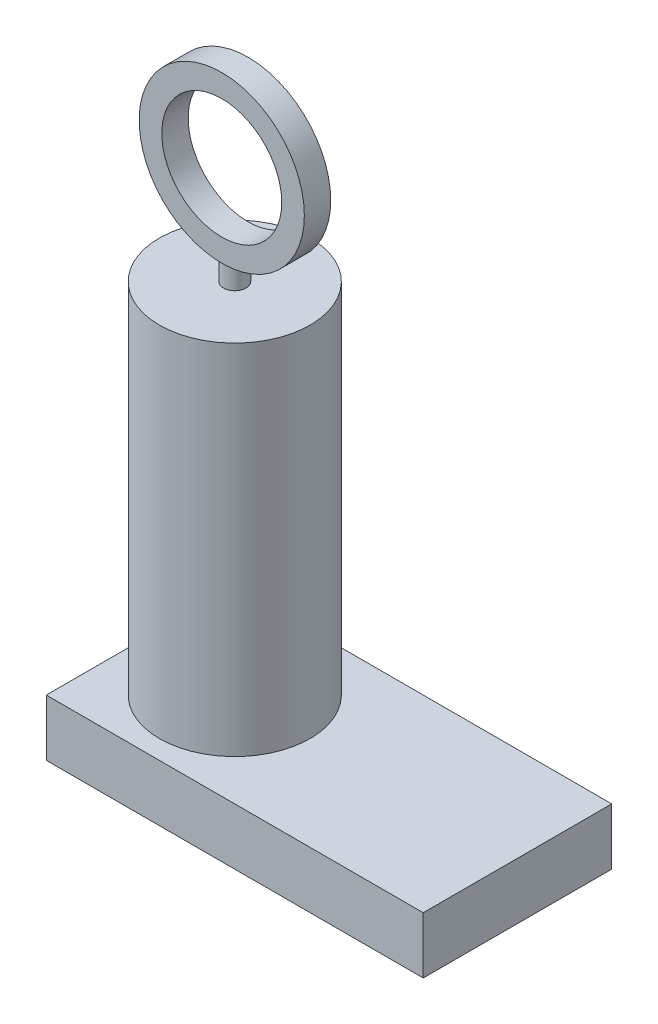
ISO-10303-21;
HEADER;
FILE_DESCRIPTION(('STEP AP214'),'2;1');
FILE_NAME('part.step','',(''),(''),'','','');
FILE_SCHEMA(('AUTOMOTIVE_DESIGN { 1 0 10303 214 1 1 1 1 }'));
ENDSEC;
DATA;
#1=APPLICATION_CONTEXT('core data for automotive mechanical design processes');
#2=APPLICATION_PROTOCOL_DEFINITION('international standard','automotive_design',2000,#1);
#3=PRODUCT_CONTEXT('',#1,'mechanical');
#4=PRODUCT('Part','Part','',(#3));
#5=PRODUCT_RELATED_PRODUCT_CATEGORY('part','',(#4));
#6=PRODUCT_DEFINITION_FORMATION('','',#4);
#7=PRODUCT_DEFINITION_CONTEXT('part definition',#1,'design');
#8=PRODUCT_DEFINITION('design','',#6,#7);
#9=PRODUCT_DEFINITION_SHAPE('','',#8);
#10=(LENGTH_UNIT() NAMED_UNIT(*) SI_UNIT(.MILLI.,.METRE.));
#11=(NAMED_UNIT(*) PLANE_ANGLE_UNIT() SI_UNIT($,.RADIAN.));
#12=(NAMED_UNIT(*) SI_UNIT($,.STERADIAN.) SOLID_ANGLE_UNIT());
#13=UNCERTAINTY_MEASURE_WITH_UNIT(LENGTH_MEASURE(1.E-05),#10,'distance_accuracy_value','');
#14=(GEOMETRIC_REPRESENTATION_CONTEXT(3) GLOBAL_UNCERTAINTY_ASSIGNED_CONTEXT((#13)) GLOBAL_UNIT_ASSIGNED_CONTEXT((#10,
#11,#12)) REPRESENTATION_CONTEXT('',''));
#15=CARTESIAN_POINT('',(0.,0.,0.));
#16=DIRECTION('',(0.,0.,1.));
#17=DIRECTION('',(1.,0.,0.));
#18=AXIS2_PLACEMENT_3D('',#15,#16,#17);
#19=CARTESIAN_POINT('',(0.,201.877080341597,6.90062805099283));
#20=DIRECTION('',(0.,0.,1.));
#21=DIRECTION('',(1.,0.,0.));
#22=AXIS2_PLACEMENT_3D('',#19,#20,#21);
#23=PLANE('',#22);
#24=CARTESIAN_POINT('',(0.,245.698971077735,6.90062805099283));
#25=DIRECTION('',(0.,0.,1.));
#26=DIRECTION('',(1.,0.,0.));
#27=AXIS2_PLACEMENT_3D('',#24,#25,#26);
#28=CIRCLE('',#27,43.821890736138);
#29=CARTESIAN_POINT('',(43.821890736138,245.698971077735,6.90062805099283));
#30=VERTEX_POINT('',#29);
#31=EDGE_CURVE('E55',#30,#30,#28,.T.);
#32=ORIENTED_EDGE('',*,*,#31,.T.);
#33=EDGE_LOOP('',(#32));
#34=FACE_BOUND('',#33,.T.);
#35=CARTESIAN_POINT('',(0.,245.698971077735,6.90062805099283));
#36=DIRECTION('',(0.,0.,1.));
#37=DIRECTION('',(1.,0.,0.));
#38=AXIS2_PLACEMENT_3D('',#35,#36,#37);
#39=CIRCLE('',#38,31.821890736138);
#40=CARTESIAN_POINT('',(31.821890736138,245.698971077735,6.90062805099283));
#41=VERTEX_POINT('',#40);
#42=EDGE_CURVE('E11',#41,#41,#39,.T.);
#43=ORIENTED_EDGE('',*,*,#42,.F.);
#44=EDGE_LOOP('',(#43));
#45=FACE_BOUND('',#44,.T.);
#46=ADVANCED_FACE('F41',(#34,#45),#23,.T.);
#47=CARTESIAN_POINT('',(0.,245.698971077735,6.));
#48=DIRECTION('',(0.,0.,1.));
#49=DIRECTION('',(1.,0.,0.));
#50=AXIS2_PLACEMENT_3D('',#47,#48,#49);
#51=CYLINDRICAL_SURFACE('',#50,31.821890736138);
#52=ORIENTED_EDGE('',*,*,#42,.T.);
#53=EDGE_LOOP('',(#52));
#54=FACE_BOUND('',#53,.T.);
#55=CARTESIAN_POINT('',(0.,245.698971077735,-7.09937194900717));
#56=DIRECTION('',(0.,0.,1.));
#57=DIRECTION('',(1.,0.,0.));
#58=AXIS2_PLACEMENT_3D('',#55,#56,#57);
#59=CIRCLE('',#58,31.821890736138);
#60=CARTESIAN_POINT('',(31.821890736138,245.698971077735,-7.09937194900717));
#61=VERTEX_POINT('',#60);
#62=EDGE_CURVE('E47',#61,#61,#59,.T.);
#63=ORIENTED_EDGE('',*,*,#62,.F.);
#64=EDGE_LOOP('',(#63));
#65=FACE_BOUND('',#64,.T.);
#66=ADVANCED_FACE('F71',(#54,#65),#51,.F.);
#67=CARTESIAN_POINT('',(0.,201.877080341597,-7.09937194900717));
#68=DIRECTION('',(0.,0.,-1.));
#69=DIRECTION('',(-1.,0.,0.));
#70=AXIS2_PLACEMENT_3D('',#67,#68,#69);
#71=PLANE('',#70);
#72=ORIENTED_EDGE('',*,*,#62,.T.);
#73=EDGE_LOOP('',(#72));
#74=FACE_BOUND('',#73,.T.);
#75=CARTESIAN_POINT('',(0.,245.698971077735,-7.09937194900717));
#76=DIRECTION('',(0.,0.,1.));
#77=DIRECTION('',(1.,0.,0.));
#78=AXIS2_PLACEMENT_3D('',#75,#76,#77);
#79=CIRCLE('',#78,43.821890736138);
#80=CARTESIAN_POINT('',(43.821890736138,245.698971077735,-7.09937194900717));
#81=VERTEX_POINT('',#80);
#82=EDGE_CURVE('E51',#81,#81,#79,.T.);
#83=ORIENTED_EDGE('',*,*,#82,.F.);
#84=EDGE_LOOP('',(#83));
#85=FACE_BOUND('',#84,.T.);
#86=ADVANCED_FACE('F65',(#74,#85),#71,.T.);
#87=CARTESIAN_POINT('',(0.,245.698971077735,6.));
#88=DIRECTION('',(0.,0.,1.));
#89=DIRECTION('',(1.,0.,0.));
#90=AXIS2_PLACEMENT_3D('',#87,#88,#89);
#91=CYLINDRICAL_SURFACE('',#90,43.821890736138);
#92=ORIENTED_EDGE('',*,*,#82,.T.);
#93=EDGE_LOOP('',(#92));
#94=FACE_BOUND('',#93,.T.);
#95=ORIENTED_EDGE('',*,*,#31,.F.);
#96=EDGE_LOOP('',(#95));
#97=FACE_BOUND('',#96,.T.);
#98=ADVANCED_FACE('F63',(#94,#97),#91,.T.);
#99=CLOSED_SHELL('',(#46,#66,#86,#98));
#100=MANIFOLD_SOLID_BREP('B2',#99);
#101=CARTESIAN_POINT('',(0.,190.,0.));
#102=DIRECTION('',(0.,-1.,0.));
#103=DIRECTION('',(0.,0.,-1.));
#104=AXIS2_PLACEMENT_3D('',#101,#102,#103);
#105=CYLINDRICAL_SURFACE('',#104,40.);
#106=CARTESIAN_POINT('',(0.,190.,0.));
#107=DIRECTION('',(0.,1.,0.));
#108=DIRECTION('',(0.,0.,1.));
#109=AXIS2_PLACEMENT_3D('',#106,#107,#108);
#110=CIRCLE('',#109,40.);
#111=CARTESIAN_POINT('',(0.,190.,40.));
#112=VERTEX_POINT('',#111);
#113=EDGE_CURVE('E112',#112,#112,#110,.T.);
#114=ORIENTED_EDGE('',*,*,#113,.F.);
#115=EDGE_LOOP('',(#114));
#116=FACE_BOUND('',#115,.T.);
#117=CARTESIAN_POINT('',(0.,0.,0.));
#118=DIRECTION('',(0.,1.,0.));
#119=DIRECTION('',(0.,0.,1.));
#120=AXIS2_PLACEMENT_3D('',#117,#118,#119);
#121=CIRCLE('',#120,40.);
#122=CARTESIAN_POINT('',(0.,0.,40.));
#123=VERTEX_POINT('',#122);
#124=EDGE_CURVE('E106',#123,#123,#121,.T.);
#125=ORIENTED_EDGE('',*,*,#124,.T.);
#126=EDGE_LOOP('',(#125));
#127=FACE_BOUND('',#126,.T.);
#128=ADVANCED_FACE('F103',(#116,#127),#105,.T.);
#129=CARTESIAN_POINT('',(0.,190.,0.));
#130=DIRECTION('',(0.,1.,0.));
#131=DIRECTION('',(0.,0.,1.));
#132=AXIS2_PLACEMENT_3D('',#129,#130,#131);
#133=PLANE('',#132);
#134=CARTESIAN_POINT('',(0.,190.,0.));
#135=DIRECTION('',(0.,1.,0.));
#136=DIRECTION('',(0.,0.,1.));
#137=AXIS2_PLACEMENT_3D('',#134,#135,#136);
#138=CIRCLE('',#137,6.);
#139=CARTESIAN_POINT('',(0.,190.,6.));
#140=VERTEX_POINT('',#139);
#141=EDGE_CURVE('E39',#140,#140,#138,.T.);
#142=ORIENTED_EDGE('',*,*,#141,.F.);
#143=EDGE_LOOP('',(#142));
#144=FACE_BOUND('',#143,.T.);
#145=ORIENTED_EDGE('',*,*,#113,.T.);
#146=EDGE_LOOP('',(#145));
#147=FACE_BOUND('',#146,.T.);
#148=ADVANCED_FACE('F206',(#144,#147),#133,.T.);
#149=CARTESIAN_POINT('',(-50.,-30.,50.));
#150=DIRECTION('',(1.,0.,0.));
#151=DIRECTION('',(0.,0.,-1.));
#152=AXIS2_PLACEMENT_3D('',#149,#150,#151);
#153=PLANE('',#152);
#154=DIRECTION('',(0.,0.,-1.));
#155=VECTOR('',#154,1.);
#156=CARTESIAN_POINT('',(-50.,0.,50.));
#157=LINE('',#156,#155);
#158=CARTESIAN_POINT('',(-50.,0.,50.));
#159=VERTEX_POINT('',#158);
#160=CARTESIAN_POINT('',(-50.,0.,-50.));
#161=VERTEX_POINT('',#160);
#162=EDGE_CURVE('E172',#159,#161,#157,.T.);
#163=ORIENTED_EDGE('',*,*,#162,.T.);
#164=DIRECTION('',(0.,1.,0.));
#165=VECTOR('',#164,1.);
#166=CARTESIAN_POINT('',(-50.,-30.,-50.));
#167=LINE('',#166,#165);
#168=CARTESIAN_POINT('',(-50.,-30.,-50.));
#169=VERTEX_POINT('',#168);
#170=EDGE_CURVE('E163',#169,#161,#167,.T.);
#171=ORIENTED_EDGE('',*,*,#170,.F.);
#172=DIRECTION('',(0.,0.,-1.));
#173=VECTOR('',#172,1.);
#174=CARTESIAN_POINT('',(-50.,-30.,50.));
#175=LINE('',#174,#173);
#176=CARTESIAN_POINT('',(-50.,-30.,50.));
#177=VERTEX_POINT('',#176);
#178=EDGE_CURVE('E157',#177,#169,#175,.T.);
#179=ORIENTED_EDGE('',*,*,#178,.F.);
#180=DIRECTION('',(0.,1.,0.));
#181=VECTOR('',#180,1.);
#182=CARTESIAN_POINT('',(-50.,-30.,50.));
#183=LINE('',#182,#181);
#184=EDGE_CURVE('E168',#177,#159,#183,.T.);
#185=ORIENTED_EDGE('',*,*,#184,.T.);
#186=EDGE_LOOP('',(#163,#171,#179,#185));
#187=FACE_BOUND('',#186,.T.);
#188=ADVANCED_FACE('F195',(#187),#153,.F.);
#189=CARTESIAN_POINT('',(-50.,-30.,-50.));
#190=DIRECTION('',(0.,0.,1.));
#191=DIRECTION('',(1.,0.,0.));
#192=AXIS2_PLACEMENT_3D('',#189,#190,#191);
#193=PLANE('',#192);
#194=DIRECTION('',(1.,0.,0.));
#195=VECTOR('',#194,1.);
#196=CARTESIAN_POINT('',(-50.,0.,-50.));
#197=LINE('',#196,#195);
#198=CARTESIAN_POINT('',(150.,0.,-50.));
#199=VERTEX_POINT('',#198);
#200=EDGE_CURVE('E162',#161,#199,#197,.T.);
#201=ORIENTED_EDGE('',*,*,#200,.T.);
#202=DIRECTION('',(0.,1.,0.));
#203=VECTOR('',#202,1.);
#204=CARTESIAN_POINT('',(150.,-30.,-50.));
#205=LINE('',#204,#203);
#206=CARTESIAN_POINT('',(150.,-30.,-50.));
#207=VERTEX_POINT('',#206);
#208=EDGE_CURVE('E160',#207,#199,#205,.T.);
#209=ORIENTED_EDGE('',*,*,#208,.F.);
#210=DIRECTION('',(1.,0.,0.));
#211=VECTOR('',#210,1.);
#212=CARTESIAN_POINT('',(-50.,-30.,-50.));
#213=LINE('',#212,#211);
#214=EDGE_CURVE('E152',#169,#207,#213,.T.);
#215=ORIENTED_EDGE('',*,*,#214,.F.);
#216=ORIENTED_EDGE('',*,*,#170,.T.);
#217=EDGE_LOOP('',(#201,#209,#215,#216));
#218=FACE_BOUND('',#217,.T.);
#219=ADVANCED_FACE('F161',(#218),#193,.F.);
#220=CARTESIAN_POINT('',(150.,-30.,50.));
#221=DIRECTION('',(-1.,0.,0.));
#222=DIRECTION('',(0.,0.,1.));
#223=AXIS2_PLACEMENT_3D('',#220,#221,#222);
#224=PLANE('',#223);
#225=DIRECTION('',(0.,0.,1.));
#226=VECTOR('',#225,1.);
#227=CARTESIAN_POINT('',(150.,0.,50.));
#228=LINE('',#227,#226);
#229=CARTESIAN_POINT('',(150.,0.,50.));
#230=VERTEX_POINT('',#229);
#231=EDGE_CURVE('E138',#199,#230,#228,.T.);
#232=ORIENTED_EDGE('',*,*,#231,.T.);
#233=DIRECTION('',(0.,1.,0.));
#234=VECTOR('',#233,1.);
#235=CARTESIAN_POINT('',(150.,-30.,50.));
#236=LINE('',#235,#234);
#237=CARTESIAN_POINT('',(150.,-30.,50.));
#238=VERTEX_POINT('',#237);
#239=EDGE_CURVE('E164',#238,#230,#236,.T.);
#240=ORIENTED_EDGE('',*,*,#239,.F.);
#241=DIRECTION('',(0.,0.,1.));
#242=VECTOR('',#241,1.);
#243=CARTESIAN_POINT('',(150.,-30.,50.));
#244=LINE('',#243,#242);
#245=EDGE_CURVE('E155',#207,#238,#244,.T.);
#246=ORIENTED_EDGE('',*,*,#245,.F.);
#247=ORIENTED_EDGE('',*,*,#208,.T.);
#248=EDGE_LOOP('',(#232,#240,#246,#247));
#249=FACE_BOUND('',#248,.T.);
#250=ADVANCED_FACE('F166',(#249),#224,.F.);
#251=CARTESIAN_POINT('',(-50.,-30.,50.));
#252=DIRECTION('',(0.,0.,-1.));
#253=DIRECTION('',(-1.,0.,0.));
#254=AXIS2_PLACEMENT_3D('',#251,#252,#253);
#255=PLANE('',#254);
#256=DIRECTION('',(-1.,0.,0.));
#257=VECTOR('',#256,1.);
#258=CARTESIAN_POINT('',(-50.,0.,50.));
#259=LINE('',#258,#257);
#260=EDGE_CURVE('E144',#230,#159,#259,.T.);
#261=ORIENTED_EDGE('',*,*,#260,.T.);
#262=ORIENTED_EDGE('',*,*,#184,.F.);
#263=DIRECTION('',(-1.,0.,0.));
#264=VECTOR('',#263,1.);
#265=CARTESIAN_POINT('',(-50.,-30.,50.));
#266=LINE('',#265,#264);
#267=EDGE_CURVE('E121',#238,#177,#266,.T.);
#268=ORIENTED_EDGE('',*,*,#267,.F.);
#269=ORIENTED_EDGE('',*,*,#239,.T.);
#270=EDGE_LOOP('',(#261,#262,#268,#269));
#271=FACE_BOUND('',#270,.T.);
#272=ADVANCED_FACE('F196',(#271),#255,.F.);
#273=CARTESIAN_POINT('',(0.,-30.,0.));
#274=DIRECTION('',(0.,-1.,0.));
#275=DIRECTION('',(0.,0.,-1.));
#276=AXIS2_PLACEMENT_3D('',#273,#274,#275);
#277=PLANE('',#276);
#278=ORIENTED_EDGE('',*,*,#178,.T.);
#279=ORIENTED_EDGE('',*,*,#214,.T.);
#280=ORIENTED_EDGE('',*,*,#245,.T.);
#281=ORIENTED_EDGE('',*,*,#267,.T.);
#282=EDGE_LOOP('',(#278,#279,#280,#281));
#283=FACE_BOUND('',#282,.T.);
#284=ADVANCED_FACE('F153',(#283),#277,.T.);
#285=CARTESIAN_POINT('',(0.,0.,0.));
#286=DIRECTION('',(0.,-1.,0.));
#287=DIRECTION('',(0.,0.,-1.));
#288=AXIS2_PLACEMENT_3D('',#285,#286,#287);
#289=PLANE('',#288);
#290=ORIENTED_EDGE('',*,*,#124,.F.);
#291=EDGE_LOOP('',(#290));
#292=FACE_BOUND('',#291,.T.);
#293=ORIENTED_EDGE('',*,*,#162,.F.);
#294=ORIENTED_EDGE('',*,*,#260,.F.);
#295=ORIENTED_EDGE('',*,*,#231,.F.);
#296=ORIENTED_EDGE('',*,*,#200,.F.);
#297=EDGE_LOOP('',(#293,#294,#295,#296));
#298=FACE_BOUND('',#297,.T.);
#299=ADVANCED_FACE('F188',(#292,#298),#289,.F.);
#300=CARTESIAN_POINT('',(0.,210.,0.));
#301=DIRECTION('',(0.,-1.,0.));
#302=DIRECTION('',(0.,0.,-1.));
#303=AXIS2_PLACEMENT_3D('',#300,#301,#302);
#304=CYLINDRICAL_SURFACE('',#303,6.);
#305=CARTESIAN_POINT('',(0.,210.,0.));
#306=DIRECTION('',(0.,1.,0.));
#307=DIRECTION('',(0.,0.,1.));
#308=AXIS2_PLACEMENT_3D('',#305,#306,#307);
#309=CIRCLE('',#308,6.);
#310=CARTESIAN_POINT('',(0.,210.,6.));
#311=VERTEX_POINT('',#310);
#312=EDGE_CURVE('E175',#311,#311,#309,.T.);
#313=ORIENTED_EDGE('',*,*,#312,.F.);
#314=EDGE_LOOP('',(#313));
#315=FACE_BOUND('',#314,.T.);
#316=ORIENTED_EDGE('',*,*,#141,.T.);
#317=EDGE_LOOP('',(#316));
#318=FACE_BOUND('',#317,.T.);
#319=ADVANCED_FACE('F191',(#315,#318),#304,.T.);
#320=CARTESIAN_POINT('',(0.,210.,0.));
#321=DIRECTION('',(0.,1.,0.));
#322=DIRECTION('',(0.,0.,1.));
#323=AXIS2_PLACEMENT_3D('',#320,#321,#322);
#324=PLANE('',#323);
#325=ORIENTED_EDGE('',*,*,#312,.T.);
#326=EDGE_LOOP('',(#325));
#327=FACE_BOUND('',#326,.T.);
#328=ADVANCED_FACE('F258',(#327),#324,.T.);
#329=CLOSED_SHELL('',(#128,#148,#188,#219,#250,#272,#284,#299,#319,#328));
#330=MANIFOLD_SOLID_BREP('B6',#329);
#331=ADVANCED_BREP_SHAPE_REPRESENTATION('',(#18,#100,#330),#14);
#332=SHAPE_DEFINITION_REPRESENTATION(#9,#331);
ENDSEC;
END-ISO-10303-21;
